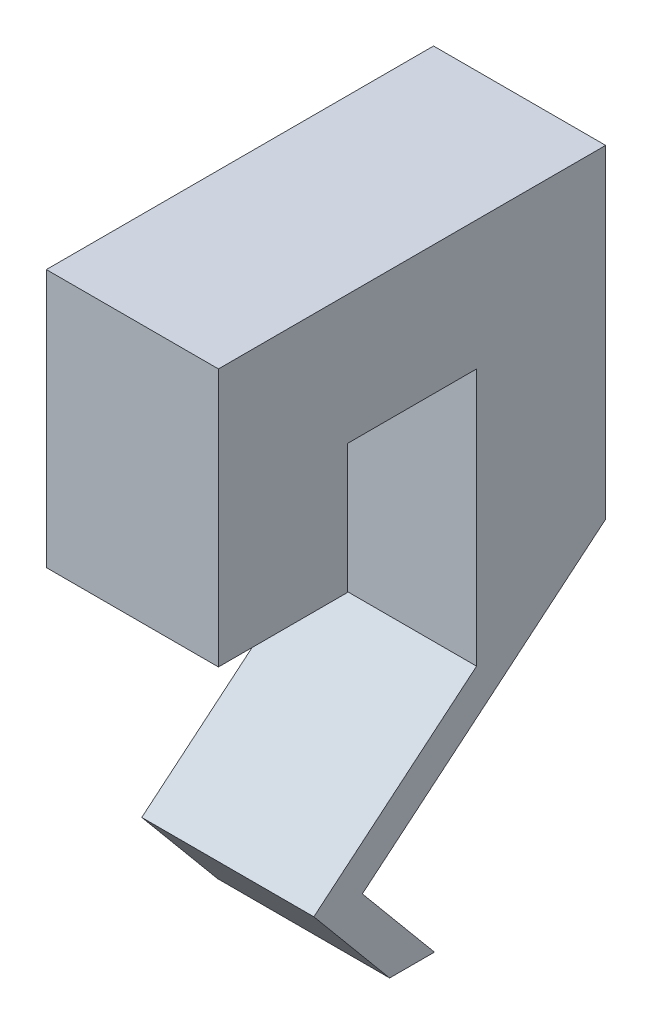
ISO-10303-21;
HEADER;
FILE_DESCRIPTION(('STEP AP214'),'2;1');
FILE_NAME('part.step','',(''),(''),'','','');
FILE_SCHEMA(('AUTOMOTIVE_DESIGN { 1 0 10303 214 1 1 1 1 }'));
ENDSEC;
DATA;
#1=APPLICATION_CONTEXT('core data for automotive mechanical design processes');
#2=APPLICATION_PROTOCOL_DEFINITION('international standard','automotive_design',2000,#1);
#3=PRODUCT_CONTEXT('',#1,'mechanical');
#4=PRODUCT('Part','Part','',(#3));
#5=PRODUCT_RELATED_PRODUCT_CATEGORY('part','',(#4));
#6=PRODUCT_DEFINITION_FORMATION('','',#4);
#7=PRODUCT_DEFINITION_CONTEXT('part definition',#1,'design');
#8=PRODUCT_DEFINITION('design','',#6,#7);
#9=PRODUCT_DEFINITION_SHAPE('','',#8);
#10=(LENGTH_UNIT() NAMED_UNIT(*) SI_UNIT(.MILLI.,.METRE.));
#11=(NAMED_UNIT(*) PLANE_ANGLE_UNIT() SI_UNIT($,.RADIAN.));
#12=(NAMED_UNIT(*) SI_UNIT($,.STERADIAN.) SOLID_ANGLE_UNIT());
#13=UNCERTAINTY_MEASURE_WITH_UNIT(LENGTH_MEASURE(1.E-05),#10,'distance_accuracy_value','');
#14=(GEOMETRIC_REPRESENTATION_CONTEXT(3) GLOBAL_UNCERTAINTY_ASSIGNED_CONTEXT((#13)) GLOBAL_UNIT_ASSIGNED_CONTEXT((#10,
#11,#12)) REPRESENTATION_CONTEXT('',''));
#15=CARTESIAN_POINT('',(0.,0.,0.));
#16=DIRECTION('',(0.,0.,1.));
#17=DIRECTION('',(1.,0.,0.));
#18=AXIS2_PLACEMENT_3D('',#15,#16,#17);
#19=CARTESIAN_POINT('',(4.,0.,0.));
#20=DIRECTION('',(0.,0.,1.));
#21=DIRECTION('',(0.,-1.,0.));
#22=AXIS2_PLACEMENT_3D('',#19,#20,#21);
#23=PLANE('',#22);
#24=DIRECTION('',(0.,1.,0.));
#25=VECTOR('',#24,1.);
#26=CARTESIAN_POINT('',(0.,0.,0.));
#27=LINE('',#26,#25);
#28=CARTESIAN_POINT('',(0.,-3.,0.));
#29=VERTEX_POINT('',#28);
#30=CARTESIAN_POINT('',(0.,0.,0.));
#31=VERTEX_POINT('',#30);
#32=EDGE_CURVE('E155',#29,#31,#27,.T.);
#33=ORIENTED_EDGE('',*,*,#32,.T.);
#34=DIRECTION('',(-1.,0.,0.));
#35=VECTOR('',#34,1.);
#36=CARTESIAN_POINT('',(4.,0.,0.));
#37=LINE('',#36,#35);
#38=CARTESIAN_POINT('',(4.,0.,0.));
#39=VERTEX_POINT('',#38);
#40=EDGE_CURVE('E11',#39,#31,#37,.T.);
#41=ORIENTED_EDGE('',*,*,#40,.F.);
#42=DIRECTION('',(0.,1.,0.));
#43=VECTOR('',#42,1.);
#44=CARTESIAN_POINT('',(4.,0.,0.));
#45=LINE('',#44,#43);
#46=CARTESIAN_POINT('',(4.,-3.,0.));
#47=VERTEX_POINT('',#46);
#48=EDGE_CURVE('E177',#47,#39,#45,.T.);
#49=ORIENTED_EDGE('',*,*,#48,.F.);
#50=DIRECTION('',(-1.,0.,0.));
#51=VECTOR('',#50,1.);
#52=CARTESIAN_POINT('',(4.,-3.,0.));
#53=LINE('',#52,#51);
#54=EDGE_CURVE('E151',#47,#29,#53,.T.);
#55=ORIENTED_EDGE('',*,*,#54,.T.);
#56=EDGE_LOOP('',(#33,#41,#49,#55));
#57=FACE_BOUND('',#56,.T.);
#58=ADVANCED_FACE('F35',(#57),#23,.F.);
#59=CARTESIAN_POINT('',(4.,0.,0.));
#60=DIRECTION('',(0.,1.,0.));
#61=DIRECTION('',(0.,0.,1.));
#62=AXIS2_PLACEMENT_3D('',#59,#60,#61);
#63=PLANE('',#62);
#64=DIRECTION('',(0.,0.,-1.));
#65=VECTOR('',#64,1.);
#66=CARTESIAN_POINT('',(0.,0.,0.));
#67=LINE('',#66,#65);
#68=CARTESIAN_POINT('',(0.,0.,-3.));
#69=VERTEX_POINT('',#68);
#70=EDGE_CURVE('E158',#31,#69,#67,.T.);
#71=ORIENTED_EDGE('',*,*,#70,.T.);
#72=DIRECTION('',(-1.,0.,0.));
#73=VECTOR('',#72,1.);
#74=CARTESIAN_POINT('',(4.,0.,-3.));
#75=LINE('',#74,#73);
#76=CARTESIAN_POINT('',(4.,0.,-3.));
#77=VERTEX_POINT('',#76);
#78=EDGE_CURVE('E43',#77,#69,#75,.T.);
#79=ORIENTED_EDGE('',*,*,#78,.F.);
#80=DIRECTION('',(0.,0.,-1.));
#81=VECTOR('',#80,1.);
#82=CARTESIAN_POINT('',(4.,0.,0.));
#83=LINE('',#82,#81);
#84=EDGE_CURVE('E106',#39,#77,#83,.T.);
#85=ORIENTED_EDGE('',*,*,#84,.F.);
#86=ORIENTED_EDGE('',*,*,#40,.T.);
#87=EDGE_LOOP('',(#71,#79,#85,#86));
#88=FACE_BOUND('',#87,.T.);
#89=ADVANCED_FACE('F255',(#88),#63,.F.);
#90=CARTESIAN_POINT('',(4.,0.,-3.));
#91=DIRECTION('',(0.,0.,-1.));
#92=DIRECTION('',(-1.,0.,0.));
#93=AXIS2_PLACEMENT_3D('',#90,#91,#92);
#94=PLANE('',#93);
#95=DIRECTION('',(0.,-1.,0.));
#96=VECTOR('',#95,1.);
#97=CARTESIAN_POINT('',(0.,0.,-3.));
#98=LINE('',#97,#96);
#99=CARTESIAN_POINT('',(0.,-5.9836322424199,-3.));
#100=VERTEX_POINT('',#99);
#101=EDGE_CURVE('E160',#69,#100,#98,.T.);
#102=ORIENTED_EDGE('',*,*,#101,.T.);
#103=DIRECTION('',(-1.,0.,0.));
#104=VECTOR('',#103,1.);
#105=CARTESIAN_POINT('',(4.,-5.9836322424199,-3.));
#106=LINE('',#105,#104);
#107=CARTESIAN_POINT('',(4.,-5.9836322424199,-3.));
#108=VERTEX_POINT('',#107);
#109=EDGE_CURVE('E196',#108,#100,#106,.T.);
#110=ORIENTED_EDGE('',*,*,#109,.F.);
#111=DIRECTION('',(0.,-1.,0.));
#112=VECTOR('',#111,1.);
#113=CARTESIAN_POINT('',(4.,0.,-3.));
#114=LINE('',#113,#112);
#115=EDGE_CURVE('E204',#77,#108,#114,.T.);
#116=ORIENTED_EDGE('',*,*,#115,.F.);
#117=ORIENTED_EDGE('',*,*,#78,.T.);
#118=EDGE_LOOP('',(#102,#110,#116,#117));
#119=FACE_BOUND('',#118,.T.);
#120=ADVANCED_FACE('F202',(#119),#94,.F.);
#121=CARTESIAN_POINT('',(4.,-5.9836322424199,-3.));
#122=DIRECTION('',(0.,-0.768082488016653,-0.640350912861181));
#123=DIRECTION('',(0.,0.640350912861181,-0.768082488016653));
#124=AXIS2_PLACEMENT_3D('',#121,#122,#123);
#125=PLANE('',#124);
#126=DIRECTION('',(0.,-0.640350912861181,0.768082488016653));
#127=VECTOR('',#126,1.);
#128=CARTESIAN_POINT('',(0.,-5.9836322424199,-3.));
#129=LINE('',#128,#127);
#130=CARTESIAN_POINT('',(0.,-9.13700645940771,0.782381606062654));
#131=VERTEX_POINT('',#130);
#132=EDGE_CURVE('E162',#100,#131,#129,.T.);
#133=ORIENTED_EDGE('',*,*,#132,.T.);
#134=DIRECTION('',(-1.,0.,0.));
#135=VECTOR('',#134,1.);
#136=CARTESIAN_POINT('',(4.,-9.13700645940771,0.782381606062654));
#137=LINE('',#136,#135);
#138=CARTESIAN_POINT('',(4.,-9.13700645940771,0.782381606062654));
#139=VERTEX_POINT('',#138);
#140=EDGE_CURVE('E193',#139,#131,#137,.T.);
#141=ORIENTED_EDGE('',*,*,#140,.F.);
#142=DIRECTION('',(0.,-0.640350912861181,0.768082488016653));
#143=VECTOR('',#142,1.);
#144=CARTESIAN_POINT('',(4.,-5.9836322424199,-3.));
#145=LINE('',#144,#143);
#146=EDGE_CURVE('E222',#108,#139,#145,.T.);
#147=ORIENTED_EDGE('',*,*,#146,.F.);
#148=ORIENTED_EDGE('',*,*,#109,.T.);
#149=EDGE_LOOP('',(#133,#141,#147,#148));
#150=FACE_BOUND('',#149,.T.);
#151=ADVANCED_FACE('F213',(#150),#125,.F.);
#152=CARTESIAN_POINT('',(4.,-9.13700645940771,0.782381606062654));
#153=DIRECTION('',(0.,0.640350912861181,-0.768082488016653));
#154=DIRECTION('',(0.,0.768082488016654,0.640350912861181));
#155=AXIS2_PLACEMENT_3D('',#152,#153,#154);
#156=PLANE('',#155);
#157=DIRECTION('',(0.,-0.768082488016653,-0.640350912861181));
#158=VECTOR('',#157,1.);
#159=CARTESIAN_POINT('',(0.,-9.13700645940771,0.782381606062654));
#160=LINE('',#159,#158);
#161=CARTESIAN_POINT('',(0.,-11.25,-0.979222601425426));
#162=VERTEX_POINT('',#161);
#163=EDGE_CURVE('E164',#131,#162,#160,.T.);
#164=ORIENTED_EDGE('',*,*,#163,.T.);
#165=DIRECTION('',(-1.,0.,0.));
#166=VECTOR('',#165,1.);
#167=CARTESIAN_POINT('',(4.,-11.25,-0.979222601425426));
#168=LINE('',#167,#166);
#169=CARTESIAN_POINT('',(4.,-11.25,-0.979222601425426));
#170=VERTEX_POINT('',#169);
#171=EDGE_CURVE('E190',#170,#162,#168,.T.);
#172=ORIENTED_EDGE('',*,*,#171,.F.);
#173=DIRECTION('',(0.,-0.768082488016653,-0.640350912861181));
#174=VECTOR('',#173,1.);
#175=CARTESIAN_POINT('',(4.,-9.13700645940771,0.782381606062654));
#176=LINE('',#175,#174);
#177=EDGE_CURVE('E219',#139,#170,#176,.T.);
#178=ORIENTED_EDGE('',*,*,#177,.F.);
#179=ORIENTED_EDGE('',*,*,#140,.T.);
#180=EDGE_LOOP('',(#164,#172,#178,#179));
#181=FACE_BOUND('',#180,.T.);
#182=ADVANCED_FACE('F217',(#181),#156,.F.);
#183=CARTESIAN_POINT('',(4.,-11.25,-0.979222601425426));
#184=DIRECTION('',(0.,1.,0.));
#185=DIRECTION('',(0.,0.,1.));
#186=AXIS2_PLACEMENT_3D('',#183,#184,#185);
#187=PLANE('',#186);
#188=DIRECTION('',(0.,0.,-1.));
#189=VECTOR('',#188,1.);
#190=CARTESIAN_POINT('',(0.,-11.25,-0.979222601425426));
#191=LINE('',#190,#189);
#192=CARTESIAN_POINT('',(0.,-11.25,-2.02077739857457));
#193=VERTEX_POINT('',#192);
#194=EDGE_CURVE('E166',#162,#193,#191,.T.);
#195=ORIENTED_EDGE('',*,*,#194,.T.);
#196=DIRECTION('',(-1.,0.,0.));
#197=VECTOR('',#196,1.);
#198=CARTESIAN_POINT('',(4.,-11.25,-2.02077739857457));
#199=LINE('',#198,#197);
#200=CARTESIAN_POINT('',(4.,-11.25,-2.02077739857457));
#201=VERTEX_POINT('',#200);
#202=EDGE_CURVE('E187',#201,#193,#199,.T.);
#203=ORIENTED_EDGE('',*,*,#202,.F.);
#204=DIRECTION('',(0.,0.,-1.));
#205=VECTOR('',#204,1.);
#206=CARTESIAN_POINT('',(4.,-11.25,-0.979222601425426));
#207=LINE('',#206,#205);
#208=EDGE_CURVE('E221',#170,#201,#207,.T.);
#209=ORIENTED_EDGE('',*,*,#208,.F.);
#210=ORIENTED_EDGE('',*,*,#171,.T.);
#211=EDGE_LOOP('',(#195,#203,#209,#210));
#212=FACE_BOUND('',#211,.T.);
#213=ADVANCED_FACE('F268',(#212),#187,.F.);
#214=CARTESIAN_POINT('',(4.,-11.25,-2.02077739857457));
#215=DIRECTION('',(0.,-0.64035091286118,0.768082488016654));
#216=DIRECTION('',(0.,-0.768082488016654,-0.64035091286118));
#217=AXIS2_PLACEMENT_3D('',#214,#215,#216);
#218=PLANE('',#217);
#219=DIRECTION('',(0.,0.768082488016654,0.64035091286118));
#220=VECTOR('',#219,1.);
#221=CARTESIAN_POINT('',(0.,-11.25,-2.02077739857457));
#222=LINE('',#221,#220);
#223=CARTESIAN_POINT('',(0.,-9.23919171953209,-0.344365114639612));
#224=VERTEX_POINT('',#223);
#225=EDGE_CURVE('E168',#193,#224,#222,.T.);
#226=ORIENTED_EDGE('',*,*,#225,.T.);
#227=DIRECTION('',(-1.,0.,0.));
#228=VECTOR('',#227,1.);
#229=CARTESIAN_POINT('',(4.,-9.23919171953209,-0.344365114639612));
#230=LINE('',#229,#228);
#231=CARTESIAN_POINT('',(4.,-9.23919171953209,-0.344365114639612));
#232=VERTEX_POINT('',#231);
#233=EDGE_CURVE('E184',#232,#224,#230,.T.);
#234=ORIENTED_EDGE('',*,*,#233,.F.);
#235=DIRECTION('',(0.,0.768082488016654,0.64035091286118));
#236=VECTOR('',#235,1.);
#237=CARTESIAN_POINT('',(4.,-11.25,-2.02077739857457));
#238=LINE('',#237,#236);
#239=EDGE_CURVE('E224',#201,#232,#238,.T.);
#240=ORIENTED_EDGE('',*,*,#239,.F.);
#241=ORIENTED_EDGE('',*,*,#202,.T.);
#242=EDGE_LOOP('',(#226,#234,#240,#241));
#243=FACE_BOUND('',#242,.T.);
#244=ADVANCED_FACE('F271',(#243),#218,.F.);
#245=CARTESIAN_POINT('',(4.,-4.5240849202588,-6.));
#246=DIRECTION('',(0.,0.768082488016653,0.640350912861181));
#247=DIRECTION('',(0.,-0.640350912861181,0.768082488016653));
#248=AXIS2_PLACEMENT_3D('',#245,#246,#247);
#249=PLANE('',#248);
#250=DIRECTION('',(0.,0.640350912861181,-0.768082488016653));
#251=VECTOR('',#250,1.);
#252=CARTESIAN_POINT('',(0.,-4.5240849202588,-6.));
#253=LINE('',#252,#251);
#254=CARTESIAN_POINT('',(0.,-4.5240849202588,-6.));
#255=VERTEX_POINT('',#254);
#256=EDGE_CURVE('E170',#224,#255,#253,.T.);
#257=ORIENTED_EDGE('',*,*,#256,.T.);
#258=DIRECTION('',(-1.,0.,0.));
#259=VECTOR('',#258,1.);
#260=CARTESIAN_POINT('',(4.,-4.5240849202588,-6.));
#261=LINE('',#260,#259);
#262=CARTESIAN_POINT('',(4.,-4.5240849202588,-6.));
#263=VERTEX_POINT('',#262);
#264=EDGE_CURVE('E181',#263,#255,#261,.T.);
#265=ORIENTED_EDGE('',*,*,#264,.F.);
#266=DIRECTION('',(0.,0.640350912861181,-0.768082488016653));
#267=VECTOR('',#266,1.);
#268=CARTESIAN_POINT('',(4.,-4.5240849202588,-6.));
#269=LINE('',#268,#267);
#270=EDGE_CURVE('E230',#232,#263,#269,.T.);
#271=ORIENTED_EDGE('',*,*,#270,.F.);
#272=ORIENTED_EDGE('',*,*,#233,.T.);
#273=EDGE_LOOP('',(#257,#265,#271,#272));
#274=FACE_BOUND('',#273,.T.);
#275=ADVANCED_FACE('F236',(#274),#249,.F.);
#276=CARTESIAN_POINT('',(4.,3.,-6.));
#277=DIRECTION('',(0.,0.,1.));
#278=DIRECTION('',(0.,-1.,0.));
#279=AXIS2_PLACEMENT_3D('',#276,#277,#278);
#280=PLANE('',#279);
#281=DIRECTION('',(0.,1.,0.));
#282=VECTOR('',#281,1.);
#283=CARTESIAN_POINT('',(0.,3.,-6.));
#284=LINE('',#283,#282);
#285=CARTESIAN_POINT('',(0.,3.,-6.));
#286=VERTEX_POINT('',#285);
#287=EDGE_CURVE('E172',#255,#286,#284,.T.);
#288=ORIENTED_EDGE('',*,*,#287,.T.);
#289=DIRECTION('',(-1.,0.,0.));
#290=VECTOR('',#289,1.);
#291=CARTESIAN_POINT('',(4.,3.,-6.));
#292=LINE('',#291,#290);
#293=CARTESIAN_POINT('',(4.,3.,-6.));
#294=VERTEX_POINT('',#293);
#295=EDGE_CURVE('E146',#294,#286,#292,.T.);
#296=ORIENTED_EDGE('',*,*,#295,.F.);
#297=DIRECTION('',(0.,1.,0.));
#298=VECTOR('',#297,1.);
#299=CARTESIAN_POINT('',(4.,3.,-6.));
#300=LINE('',#299,#298);
#301=EDGE_CURVE('E137',#263,#294,#300,.T.);
#302=ORIENTED_EDGE('',*,*,#301,.F.);
#303=ORIENTED_EDGE('',*,*,#264,.T.);
#304=EDGE_LOOP('',(#288,#296,#302,#303));
#305=FACE_BOUND('',#304,.T.);
#306=ADVANCED_FACE('F240',(#305),#280,.F.);
#307=CARTESIAN_POINT('',(4.,3.,3.));
#308=DIRECTION('',(0.,-1.,0.));
#309=DIRECTION('',(0.,0.,-1.));
#310=AXIS2_PLACEMENT_3D('',#307,#308,#309);
#311=PLANE('',#310);
#312=DIRECTION('',(0.,0.,1.));
#313=VECTOR('',#312,1.);
#314=CARTESIAN_POINT('',(0.,3.,3.));
#315=LINE('',#314,#313);
#316=CARTESIAN_POINT('',(0.,3.,3.));
#317=VERTEX_POINT('',#316);
#318=EDGE_CURVE('E145',#286,#317,#315,.T.);
#319=ORIENTED_EDGE('',*,*,#318,.T.);
#320=DIRECTION('',(-1.,0.,0.));
#321=VECTOR('',#320,1.);
#322=CARTESIAN_POINT('',(4.,3.,3.));
#323=LINE('',#322,#321);
#324=CARTESIAN_POINT('',(4.,3.,3.));
#325=VERTEX_POINT('',#324);
#326=EDGE_CURVE('E142',#325,#317,#323,.T.);
#327=ORIENTED_EDGE('',*,*,#326,.F.);
#328=DIRECTION('',(0.,0.,1.));
#329=VECTOR('',#328,1.);
#330=CARTESIAN_POINT('',(4.,3.,3.));
#331=LINE('',#330,#329);
#332=EDGE_CURVE('E131',#294,#325,#331,.T.);
#333=ORIENTED_EDGE('',*,*,#332,.F.);
#334=ORIENTED_EDGE('',*,*,#295,.T.);
#335=EDGE_LOOP('',(#319,#327,#333,#334));
#336=FACE_BOUND('',#335,.T.);
#337=ADVANCED_FACE('F143',(#336),#311,.F.);
#338=CARTESIAN_POINT('',(4.,-3.,3.));
#339=DIRECTION('',(0.,0.,-1.));
#340=DIRECTION('',(0.,1.,0.));
#341=AXIS2_PLACEMENT_3D('',#338,#339,#340);
#342=PLANE('',#341);
#343=DIRECTION('',(0.,-1.,0.));
#344=VECTOR('',#343,1.);
#345=CARTESIAN_POINT('',(0.,-3.,3.));
#346=LINE('',#345,#344);
#347=CARTESIAN_POINT('',(0.,-3.,3.));
#348=VERTEX_POINT('',#347);
#349=EDGE_CURVE('E92',#317,#348,#346,.T.);
#350=ORIENTED_EDGE('',*,*,#349,.T.);
#351=DIRECTION('',(-1.,0.,0.));
#352=VECTOR('',#351,1.);
#353=CARTESIAN_POINT('',(4.,-3.,3.));
#354=LINE('',#353,#352);
#355=CARTESIAN_POINT('',(4.,-3.,3.));
#356=VERTEX_POINT('',#355);
#357=EDGE_CURVE('E147',#356,#348,#354,.T.);
#358=ORIENTED_EDGE('',*,*,#357,.F.);
#359=DIRECTION('',(0.,-1.,0.));
#360=VECTOR('',#359,1.);
#361=CARTESIAN_POINT('',(4.,-3.,3.));
#362=LINE('',#361,#360);
#363=EDGE_CURVE('E135',#325,#356,#362,.T.);
#364=ORIENTED_EDGE('',*,*,#363,.F.);
#365=ORIENTED_EDGE('',*,*,#326,.T.);
#366=EDGE_LOOP('',(#350,#358,#364,#365));
#367=FACE_BOUND('',#366,.T.);
#368=ADVANCED_FACE('F149',(#367),#342,.F.);
#369=CARTESIAN_POINT('',(4.,-3.,0.));
#370=DIRECTION('',(0.,1.,0.));
#371=DIRECTION('',(0.,0.,1.));
#372=AXIS2_PLACEMENT_3D('',#369,#370,#371);
#373=PLANE('',#372);
#374=DIRECTION('',(0.,0.,-1.));
#375=VECTOR('',#374,1.);
#376=CARTESIAN_POINT('',(0.,-3.,0.));
#377=LINE('',#376,#375);
#378=EDGE_CURVE('E98',#348,#29,#377,.T.);
#379=ORIENTED_EDGE('',*,*,#378,.T.);
#380=ORIENTED_EDGE('',*,*,#54,.F.);
#381=DIRECTION('',(0.,0.,-1.));
#382=VECTOR('',#381,1.);
#383=CARTESIAN_POINT('',(4.,-3.,0.));
#384=LINE('',#383,#382);
#385=EDGE_CURVE('E51',#356,#47,#384,.T.);
#386=ORIENTED_EDGE('',*,*,#385,.F.);
#387=ORIENTED_EDGE('',*,*,#357,.T.);
#388=EDGE_LOOP('',(#379,#380,#386,#387));
#389=FACE_BOUND('',#388,.T.);
#390=ADVANCED_FACE('F244',(#389),#373,.F.);
#391=CARTESIAN_POINT('',(4.,0.,0.));
#392=DIRECTION('',(-1.,0.,0.));
#393=DIRECTION('',(0.,0.,1.));
#394=AXIS2_PLACEMENT_3D('',#391,#392,#393);
#395=PLANE('',#394);
#396=ORIENTED_EDGE('',*,*,#48,.T.);
#397=ORIENTED_EDGE('',*,*,#84,.T.);
#398=ORIENTED_EDGE('',*,*,#115,.T.);
#399=ORIENTED_EDGE('',*,*,#146,.T.);
#400=ORIENTED_EDGE('',*,*,#177,.T.);
#401=ORIENTED_EDGE('',*,*,#208,.T.);
#402=ORIENTED_EDGE('',*,*,#239,.T.);
#403=ORIENTED_EDGE('',*,*,#270,.T.);
#404=ORIENTED_EDGE('',*,*,#301,.T.);
#405=ORIENTED_EDGE('',*,*,#332,.T.);
#406=ORIENTED_EDGE('',*,*,#363,.T.);
#407=ORIENTED_EDGE('',*,*,#385,.T.);
#408=EDGE_LOOP('',(#396,#397,#398,#399,#400,#401,#402,#403,#404,#405,#406,#407));
#409=FACE_BOUND('',#408,.T.);
#410=ADVANCED_FACE('F133',(#409),#395,.F.);
#411=CARTESIAN_POINT('',(0.,0.,0.));
#412=DIRECTION('',(-1.,0.,0.));
#413=DIRECTION('',(0.,0.,1.));
#414=AXIS2_PLACEMENT_3D('',#411,#412,#413);
#415=PLANE('',#414);
#416=ORIENTED_EDGE('',*,*,#32,.F.);
#417=ORIENTED_EDGE('',*,*,#378,.F.);
#418=ORIENTED_EDGE('',*,*,#349,.F.);
#419=ORIENTED_EDGE('',*,*,#318,.F.);
#420=ORIENTED_EDGE('',*,*,#287,.F.);
#421=ORIENTED_EDGE('',*,*,#256,.F.);
#422=ORIENTED_EDGE('',*,*,#225,.F.);
#423=ORIENTED_EDGE('',*,*,#194,.F.);
#424=ORIENTED_EDGE('',*,*,#163,.F.);
#425=ORIENTED_EDGE('',*,*,#132,.F.);
#426=ORIENTED_EDGE('',*,*,#101,.F.);
#427=ORIENTED_EDGE('',*,*,#70,.F.);
#428=EDGE_LOOP('',(#416,#417,#418,#419,#420,#421,#422,#423,#424,#425,#426,#427));
#429=FACE_BOUND('',#428,.T.);
#430=ADVANCED_FACE('F208',(#429),#415,.T.);
#431=CLOSED_SHELL('',(#58,#89,#120,#151,#182,#213,#244,#275,#306,#337,#368,#390,#410,#430));
#432=MANIFOLD_SOLID_BREP('B2',#431);
#433=ADVANCED_BREP_SHAPE_REPRESENTATION('',(#18,#432),#14);
#434=SHAPE_DEFINITION_REPRESENTATION(#9,#433);
ENDSEC;
END-ISO-10303-21;
